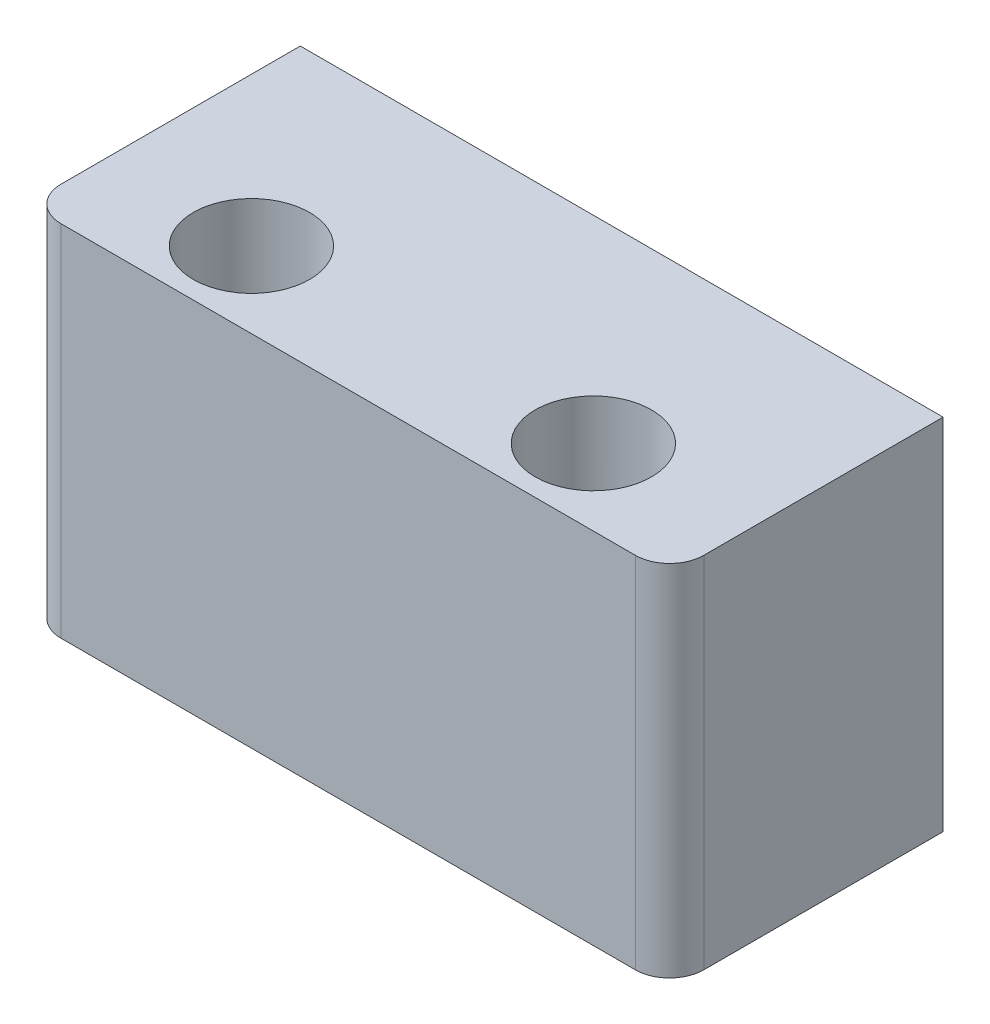
ISO-10303-21;
HEADER;
FILE_DESCRIPTION(('STEP AP214'),'2;1');
FILE_NAME('part.step','',(''),(''),'','','');
FILE_SCHEMA(('AUTOMOTIVE_DESIGN { 1 0 10303 214 1 1 1 1 }'));
ENDSEC;
DATA;
#1=APPLICATION_CONTEXT('core data for automotive mechanical design processes');
#2=APPLICATION_PROTOCOL_DEFINITION('international standard','automotive_design',2000,#1);
#3=PRODUCT_CONTEXT('',#1,'mechanical');
#4=PRODUCT('Part','Part','',(#3));
#5=PRODUCT_RELATED_PRODUCT_CATEGORY('part','',(#4));
#6=PRODUCT_DEFINITION_FORMATION('','',#4);
#7=PRODUCT_DEFINITION_CONTEXT('part definition',#1,'design');
#8=PRODUCT_DEFINITION('design','',#6,#7);
#9=PRODUCT_DEFINITION_SHAPE('','',#8);
#10=(LENGTH_UNIT() NAMED_UNIT(*) SI_UNIT(.MILLI.,.METRE.));
#11=(NAMED_UNIT(*) PLANE_ANGLE_UNIT() SI_UNIT($,.RADIAN.));
#12=(NAMED_UNIT(*) SI_UNIT($,.STERADIAN.) SOLID_ANGLE_UNIT());
#13=UNCERTAINTY_MEASURE_WITH_UNIT(LENGTH_MEASURE(1.E-05),#10,'distance_accuracy_value','');
#14=(GEOMETRIC_REPRESENTATION_CONTEXT(3) GLOBAL_UNCERTAINTY_ASSIGNED_CONTEXT((#13)) GLOBAL_UNIT_ASSIGNED_CONTEXT((#10,
#11,#12)) REPRESENTATION_CONTEXT('',''));
#15=CARTESIAN_POINT('',(0.,0.,0.));
#16=DIRECTION('',(0.,0.,1.));
#17=DIRECTION('',(1.,0.,0.));
#18=AXIS2_PLACEMENT_3D('',#15,#16,#17);
#19=CARTESIAN_POINT('',(0.,10.5,0.));
#20=DIRECTION('',(0.,-1.,0.));
#21=DIRECTION('',(0.,0.,-1.));
#22=AXIS2_PLACEMENT_3D('',#19,#20,#21);
#23=PLANE('',#22);
#24=CARTESIAN_POINT('',(14.3502473012583,10.5,5.77922637132028));
#25=DIRECTION('',(0.,1.,0.));
#26=DIRECTION('',(0.,0.,1.));
#27=AXIS2_PLACEMENT_3D('',#24,#25,#26);
#28=CIRCLE('',#27,1.69999999999999);
#29=CARTESIAN_POINT('',(14.3502473012583,10.5,7.47922637132027));
#30=VERTEX_POINT('',#29);
#31=EDGE_CURVE('E150',#30,#30,#28,.T.);
#32=ORIENTED_EDGE('',*,*,#31,.F.);
#33=EDGE_LOOP('',(#32));
#34=FACE_BOUND('',#33,.T.);
#35=DIRECTION('',(1.,0.,0.));
#36=VECTOR('',#35,1.);
#37=CARTESIAN_POINT('',(0.,10.5,8.));
#38=LINE('',#37,#36);
#39=CARTESIAN_POINT('',(1.,10.5,8.));
#40=VERTEX_POINT('',#39);
#41=CARTESIAN_POINT('',(17.8,10.5,8.));
#42=VERTEX_POINT('',#41);
#43=EDGE_CURVE('E95',#40,#42,#38,.T.);
#44=ORIENTED_EDGE('',*,*,#43,.T.);
#45=CARTESIAN_POINT('',(17.8,10.5,7.));
#46=DIRECTION('',(0.,-1.,0.));
#47=DIRECTION('',(0.,0.,-1.));
#48=AXIS2_PLACEMENT_3D('',#45,#46,#47);
#49=CIRCLE('',#48,1.);
#50=CARTESIAN_POINT('',(18.8,10.5,7.));
#51=VERTEX_POINT('',#50);
#52=EDGE_CURVE('E43',#42,#51,#49,.F.);
#53=ORIENTED_EDGE('',*,*,#52,.T.);
#54=DIRECTION('',(0.,0.,-1.));
#55=VECTOR('',#54,1.);
#56=CARTESIAN_POINT('',(18.8,10.5,0.));
#57=LINE('',#56,#55);
#58=CARTESIAN_POINT('',(18.8,10.5,0.));
#59=VERTEX_POINT('',#58);
#60=EDGE_CURVE('E101',#51,#59,#57,.T.);
#61=ORIENTED_EDGE('',*,*,#60,.T.);
#62=DIRECTION('',(-1.,0.,0.));
#63=VECTOR('',#62,1.);
#64=CARTESIAN_POINT('',(0.,10.5,0.));
#65=LINE('',#64,#63);
#66=CARTESIAN_POINT('',(0.,10.5,0.));
#67=VERTEX_POINT('',#66);
#68=EDGE_CURVE('E96',#59,#67,#65,.T.);
#69=ORIENTED_EDGE('',*,*,#68,.T.);
#70=DIRECTION('',(0.,0.,1.));
#71=VECTOR('',#70,1.);
#72=CARTESIAN_POINT('',(0.,10.5,0.));
#73=LINE('',#72,#71);
#74=CARTESIAN_POINT('',(0.,10.5,7.));
#75=VERTEX_POINT('',#74);
#76=EDGE_CURVE('E87',#67,#75,#73,.T.);
#77=ORIENTED_EDGE('',*,*,#76,.T.);
#78=CARTESIAN_POINT('',(1.,10.5,7.));
#79=DIRECTION('',(0.,-1.,0.));
#80=DIRECTION('',(0.,0.,-1.));
#81=AXIS2_PLACEMENT_3D('',#78,#79,#80);
#82=CIRCLE('',#81,1.);
#83=EDGE_CURVE('E126',#75,#40,#82,.F.);
#84=ORIENTED_EDGE('',*,*,#83,.T.);
#85=EDGE_LOOP('',(#44,#53,#61,#69,#77,#84));
#86=FACE_BOUND('',#85,.T.);
#87=CARTESIAN_POINT('',(4.35024730125826,10.5,5.77922637132028));
#88=DIRECTION('',(0.,1.,0.));
#89=DIRECTION('',(0.,0.,1.));
#90=AXIS2_PLACEMENT_3D('',#87,#88,#89);
#91=CIRCLE('',#90,1.69999999999999);
#92=CARTESIAN_POINT('',(4.35024730125826,10.5,7.47922637132027));
#93=VERTEX_POINT('',#92);
#94=EDGE_CURVE('E156',#93,#93,#91,.T.);
#95=ORIENTED_EDGE('',*,*,#94,.F.);
#96=EDGE_LOOP('',(#95));
#97=FACE_BOUND('',#96,.T.);
#98=ADVANCED_FACE('F35',(#34,#86,#97),#23,.F.);
#99=CARTESIAN_POINT('',(0.,10.5,0.));
#100=DIRECTION('',(0.,0.,1.));
#101=DIRECTION('',(1.,0.,0.));
#102=AXIS2_PLACEMENT_3D('',#99,#100,#101);
#103=PLANE('',#102);
#104=DIRECTION('',(-1.,0.,0.));
#105=VECTOR('',#104,1.);
#106=CARTESIAN_POINT('',(0.,0.,0.));
#107=LINE('',#106,#105);
#108=CARTESIAN_POINT('',(18.8,0.,0.));
#109=VERTEX_POINT('',#108);
#110=CARTESIAN_POINT('',(0.,0.,0.));
#111=VERTEX_POINT('',#110);
#112=EDGE_CURVE('E109',#109,#111,#107,.T.);
#113=ORIENTED_EDGE('',*,*,#112,.T.);
#114=DIRECTION('',(0.,-1.,0.));
#115=VECTOR('',#114,1.);
#116=CARTESIAN_POINT('',(0.,10.5,0.));
#117=LINE('',#116,#115);
#118=EDGE_CURVE('E91',#67,#111,#117,.T.);
#119=ORIENTED_EDGE('',*,*,#118,.F.);
#120=ORIENTED_EDGE('',*,*,#68,.F.);
#121=DIRECTION('',(0.,-1.,0.));
#122=VECTOR('',#121,1.);
#123=CARTESIAN_POINT('',(18.8,10.5,0.));
#124=LINE('',#123,#122);
#125=EDGE_CURVE('E111',#59,#109,#124,.T.);
#126=ORIENTED_EDGE('',*,*,#125,.T.);
#127=EDGE_LOOP('',(#113,#119,#120,#126));
#128=FACE_BOUND('',#127,.T.);
#129=ADVANCED_FACE('F107',(#128),#103,.F.);
#130=CARTESIAN_POINT('',(0.,10.5,0.));
#131=DIRECTION('',(1.,0.,0.));
#132=DIRECTION('',(0.,0.,-1.));
#133=AXIS2_PLACEMENT_3D('',#130,#131,#132);
#134=PLANE('',#133);
#135=DIRECTION('',(0.,0.,1.));
#136=VECTOR('',#135,1.);
#137=CARTESIAN_POINT('',(0.,0.,0.));
#138=LINE('',#137,#136);
#139=CARTESIAN_POINT('',(0.,0.,7.));
#140=VERTEX_POINT('',#139);
#141=EDGE_CURVE('E141',#111,#140,#138,.T.);
#142=ORIENTED_EDGE('',*,*,#141,.T.);
#143=DIRECTION('',(0.,-1.,0.));
#144=VECTOR('',#143,1.);
#145=CARTESIAN_POINT('',(0.,10.5,7.));
#146=LINE('',#145,#144);
#147=EDGE_CURVE('E11',#140,#75,#146,.F.);
#148=ORIENTED_EDGE('',*,*,#147,.T.);
#149=ORIENTED_EDGE('',*,*,#76,.F.);
#150=ORIENTED_EDGE('',*,*,#118,.T.);
#151=EDGE_LOOP('',(#142,#148,#149,#150));
#152=FACE_BOUND('',#151,.T.);
#153=ADVANCED_FACE('F89',(#152),#134,.F.);
#154=CARTESIAN_POINT('',(0.,10.5,8.));
#155=DIRECTION('',(0.,0.,-1.));
#156=DIRECTION('',(-1.,0.,0.));
#157=AXIS2_PLACEMENT_3D('',#154,#155,#156);
#158=PLANE('',#157);
#159=DIRECTION('',(1.,0.,0.));
#160=VECTOR('',#159,1.);
#161=CARTESIAN_POINT('',(0.,0.,8.));
#162=LINE('',#161,#160);
#163=CARTESIAN_POINT('',(1.,0.,8.));
#164=VERTEX_POINT('',#163);
#165=CARTESIAN_POINT('',(17.8,0.,8.));
#166=VERTEX_POINT('',#165);
#167=EDGE_CURVE('E138',#164,#166,#162,.T.);
#168=ORIENTED_EDGE('',*,*,#167,.T.);
#169=DIRECTION('',(0.,-1.,0.));
#170=VECTOR('',#169,1.);
#171=CARTESIAN_POINT('',(17.8,10.5,8.));
#172=LINE('',#171,#170);
#173=EDGE_CURVE('E56',#166,#42,#172,.F.);
#174=ORIENTED_EDGE('',*,*,#173,.T.);
#175=ORIENTED_EDGE('',*,*,#43,.F.);
#176=DIRECTION('',(0.,-1.,0.));
#177=VECTOR('',#176,1.);
#178=CARTESIAN_POINT('',(1.,10.5,8.));
#179=LINE('',#178,#177);
#180=EDGE_CURVE('E122',#40,#164,#179,.T.);
#181=ORIENTED_EDGE('',*,*,#180,.T.);
#182=EDGE_LOOP('',(#168,#174,#175,#181));
#183=FACE_BOUND('',#182,.T.);
#184=ADVANCED_FACE('F139',(#183),#158,.F.);
#185=CARTESIAN_POINT('',(18.8,10.5,0.));
#186=DIRECTION('',(-1.,0.,0.));
#187=DIRECTION('',(0.,0.,1.));
#188=AXIS2_PLACEMENT_3D('',#185,#186,#187);
#189=PLANE('',#188);
#190=ORIENTED_EDGE('',*,*,#60,.F.);
#191=DIRECTION('',(0.,-1.,0.));
#192=VECTOR('',#191,1.);
#193=CARTESIAN_POINT('',(18.8,10.5,7.));
#194=LINE('',#193,#192);
#195=CARTESIAN_POINT('',(18.8,0.,7.));
#196=VERTEX_POINT('',#195);
#197=EDGE_CURVE('E110',#51,#196,#194,.T.);
#198=ORIENTED_EDGE('',*,*,#197,.T.);
#199=DIRECTION('',(0.,0.,-1.));
#200=VECTOR('',#199,1.);
#201=CARTESIAN_POINT('',(18.8,0.,0.));
#202=LINE('',#201,#200);
#203=EDGE_CURVE('E105',#196,#109,#202,.T.);
#204=ORIENTED_EDGE('',*,*,#203,.T.);
#205=ORIENTED_EDGE('',*,*,#125,.F.);
#206=EDGE_LOOP('',(#190,#198,#204,#205));
#207=FACE_BOUND('',#206,.T.);
#208=ADVANCED_FACE('F131',(#207),#189,.F.);
#209=CARTESIAN_POINT('',(0.,0.,0.));
#210=DIRECTION('',(0.,-1.,0.));
#211=DIRECTION('',(0.,0.,-1.));
#212=AXIS2_PLACEMENT_3D('',#209,#210,#211);
#213=PLANE('',#212);
#214=CARTESIAN_POINT('',(4.35024730125826,0.,5.77922637132028));
#215=DIRECTION('',(0.,-1.,0.));
#216=DIRECTION('',(0.,0.,-1.));
#217=AXIS2_PLACEMENT_3D('',#214,#215,#216);
#218=CIRCLE('',#217,1.69999999999999);
#219=CARTESIAN_POINT('',(4.35024730125826,0.,4.07922637132028));
#220=VERTEX_POINT('',#219);
#221=EDGE_CURVE('E153',#220,#220,#218,.T.);
#222=ORIENTED_EDGE('',*,*,#221,.F.);
#223=EDGE_LOOP('',(#222));
#224=FACE_BOUND('',#223,.T.);
#225=CARTESIAN_POINT('',(14.3502473012583,0.,5.77922637132028));
#226=DIRECTION('',(0.,-1.,0.));
#227=DIRECTION('',(0.,0.,-1.));
#228=AXIS2_PLACEMENT_3D('',#225,#226,#227);
#229=CIRCLE('',#228,1.69999999999999);
#230=CARTESIAN_POINT('',(14.3502473012583,0.,4.07922637132028));
#231=VERTEX_POINT('',#230);
#232=EDGE_CURVE('E145',#231,#231,#229,.T.);
#233=ORIENTED_EDGE('',*,*,#232,.F.);
#234=EDGE_LOOP('',(#233));
#235=FACE_BOUND('',#234,.T.);
#236=ORIENTED_EDGE('',*,*,#203,.F.);
#237=CARTESIAN_POINT('',(17.8,0.,7.));
#238=DIRECTION('',(0.,-1.,0.));
#239=DIRECTION('',(0.,0.,-1.));
#240=AXIS2_PLACEMENT_3D('',#237,#238,#239);
#241=CIRCLE('',#240,1.);
#242=EDGE_CURVE('E120',#196,#166,#241,.T.);
#243=ORIENTED_EDGE('',*,*,#242,.T.);
#244=ORIENTED_EDGE('',*,*,#167,.F.);
#245=CARTESIAN_POINT('',(1.,0.,7.));
#246=DIRECTION('',(0.,-1.,0.));
#247=DIRECTION('',(0.,0.,-1.));
#248=AXIS2_PLACEMENT_3D('',#245,#246,#247);
#249=CIRCLE('',#248,1.);
#250=EDGE_CURVE('E114',#164,#140,#249,.T.);
#251=ORIENTED_EDGE('',*,*,#250,.T.);
#252=ORIENTED_EDGE('',*,*,#141,.F.);
#253=ORIENTED_EDGE('',*,*,#112,.F.);
#254=EDGE_LOOP('',(#236,#243,#244,#251,#252,#253));
#255=FACE_BOUND('',#254,.T.);
#256=ADVANCED_FACE('F137',(#224,#235,#255),#213,.T.);
#257=CARTESIAN_POINT('',(17.8,10.5,7.));
#258=DIRECTION('',(0.,-1.,0.));
#259=DIRECTION('',(0.,0.,-1.));
#260=AXIS2_PLACEMENT_3D('',#257,#258,#259);
#261=CYLINDRICAL_SURFACE('',#260,1.);
#262=ORIENTED_EDGE('',*,*,#52,.F.);
#263=ORIENTED_EDGE('',*,*,#173,.F.);
#264=ORIENTED_EDGE('',*,*,#242,.F.);
#265=ORIENTED_EDGE('',*,*,#197,.F.);
#266=EDGE_LOOP('',(#262,#263,#264,#265));
#267=FACE_BOUND('',#266,.T.);
#268=ADVANCED_FACE('F134',(#267),#261,.T.);
#269=CARTESIAN_POINT('',(1.,10.5,7.));
#270=DIRECTION('',(0.,-1.,0.));
#271=DIRECTION('',(0.,0.,-1.));
#272=AXIS2_PLACEMENT_3D('',#269,#270,#271);
#273=CYLINDRICAL_SURFACE('',#272,1.);
#274=ORIENTED_EDGE('',*,*,#83,.F.);
#275=ORIENTED_EDGE('',*,*,#147,.F.);
#276=ORIENTED_EDGE('',*,*,#250,.F.);
#277=ORIENTED_EDGE('',*,*,#180,.F.);
#278=EDGE_LOOP('',(#274,#275,#276,#277));
#279=FACE_BOUND('',#278,.T.);
#280=ADVANCED_FACE('F37',(#279),#273,.T.);
#281=CARTESIAN_POINT('',(14.3502473012583,10.5,5.77922637132028));
#282=DIRECTION('',(0.,1.,0.));
#283=DIRECTION('',(0.,0.,1.));
#284=AXIS2_PLACEMENT_3D('',#281,#282,#283);
#285=CYLINDRICAL_SURFACE('',#284,1.69999999999999);
#286=ORIENTED_EDGE('',*,*,#31,.T.);
#287=EDGE_LOOP('',(#286));
#288=FACE_BOUND('',#287,.T.);
#289=ORIENTED_EDGE('',*,*,#232,.T.);
#290=EDGE_LOOP('',(#289));
#291=FACE_BOUND('',#290,.T.);
#292=ADVANCED_FACE('F172',(#288,#291),#285,.F.);
#293=CARTESIAN_POINT('',(4.35024730125826,10.5,5.77922637132028));
#294=DIRECTION('',(0.,1.,0.));
#295=DIRECTION('',(0.,0.,1.));
#296=AXIS2_PLACEMENT_3D('',#293,#294,#295);
#297=CYLINDRICAL_SURFACE('',#296,1.69999999999999);
#298=ORIENTED_EDGE('',*,*,#94,.T.);
#299=EDGE_LOOP('',(#298));
#300=FACE_BOUND('',#299,.T.);
#301=ORIENTED_EDGE('',*,*,#221,.T.);
#302=EDGE_LOOP('',(#301));
#303=FACE_BOUND('',#302,.T.);
#304=ADVANCED_FACE('F160',(#300,#303),#297,.F.);
#305=CLOSED_SHELL('',(#98,#129,#153,#184,#208,#256,#268,#280,#292,#304));
#306=MANIFOLD_SOLID_BREP('B2',#305);
#307=ADVANCED_BREP_SHAPE_REPRESENTATION('',(#18,#306),#14);
#308=SHAPE_DEFINITION_REPRESENTATION(#9,#307);
ENDSEC;
END-ISO-10303-21;
